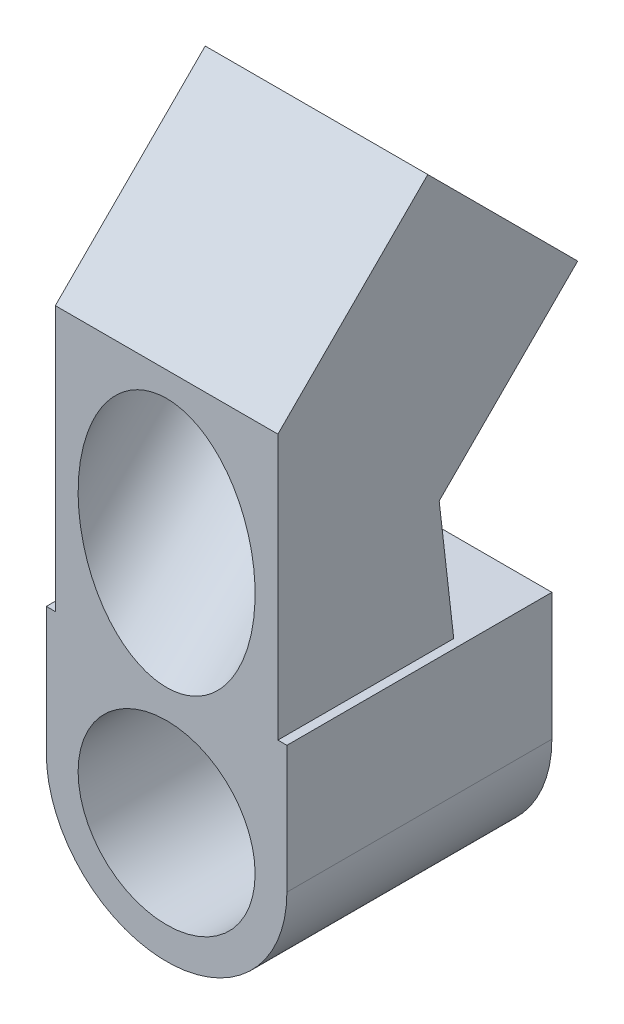
ISO-10303-21;
HEADER;
FILE_DESCRIPTION(('STEP AP214'),'2;1');
FILE_NAME('part.step','',(''),(''),'','','');
FILE_SCHEMA(('AUTOMOTIVE_DESIGN { 1 0 10303 214 1 1 1 1 }'));
ENDSEC;
DATA;
#1=APPLICATION_CONTEXT('core data for automotive mechanical design processes');
#2=APPLICATION_PROTOCOL_DEFINITION('international standard','automotive_design',2000,#1);
#3=PRODUCT_CONTEXT('',#1,'mechanical');
#4=PRODUCT('Part','Part','',(#3));
#5=PRODUCT_RELATED_PRODUCT_CATEGORY('part','',(#4));
#6=PRODUCT_DEFINITION_FORMATION('','',#4);
#7=PRODUCT_DEFINITION_CONTEXT('part definition',#1,'design');
#8=PRODUCT_DEFINITION('design','',#6,#7);
#9=PRODUCT_DEFINITION_SHAPE('','',#8);
#10=(LENGTH_UNIT() NAMED_UNIT(*) SI_UNIT(.MILLI.,.METRE.));
#11=(NAMED_UNIT(*) PLANE_ANGLE_UNIT() SI_UNIT($,.RADIAN.));
#12=(NAMED_UNIT(*) SI_UNIT($,.STERADIAN.) SOLID_ANGLE_UNIT());
#13=UNCERTAINTY_MEASURE_WITH_UNIT(LENGTH_MEASURE(1.E-05),#10,'distance_accuracy_value','');
#14=(GEOMETRIC_REPRESENTATION_CONTEXT(3) GLOBAL_UNCERTAINTY_ASSIGNED_CONTEXT((#13)) GLOBAL_UNIT_ASSIGNED_CONTEXT((#10,
#11,#12)) REPRESENTATION_CONTEXT('',''));
#15=CARTESIAN_POINT('',(0.,0.,0.));
#16=DIRECTION('',(0.,0.,1.));
#17=DIRECTION('',(1.,0.,0.));
#18=AXIS2_PLACEMENT_3D('',#15,#16,#17);
#19=CARTESIAN_POINT('',(-11.35,12.,-12.5));
#20=DIRECTION('',(0.,1.,0.));
#21=DIRECTION('',(-1.,0.,0.));
#22=AXIS2_PLACEMENT_3D('',#19,#20,#21);
#23=PLANE('',#22);
#24=DIRECTION('',(-1.,0.,0.));
#25=VECTOR('',#24,1.);
#26=CARTESIAN_POINT('',(-11.35,12.,12.5));
#27=LINE('',#26,#25);
#28=CARTESIAN_POINT('',(-10.5,12.,12.5));
#29=VERTEX_POINT('',#28);
#30=CARTESIAN_POINT('',(-11.35,12.,12.5));
#31=VERTEX_POINT('',#30);
#32=EDGE_CURVE('E62',#29,#31,#27,.T.);
#33=ORIENTED_EDGE('',*,*,#32,.F.);
#34=DIRECTION('',(0.,0.,-1.));
#35=VECTOR('',#34,1.);
#36=CARTESIAN_POINT('',(-10.5,12.,12.5));
#37=LINE('',#36,#35);
#38=CARTESIAN_POINT('',(-10.5,12.,-4.09010033326542));
#39=VERTEX_POINT('',#38);
#40=EDGE_CURVE('E57',#29,#39,#37,.T.);
#41=ORIENTED_EDGE('',*,*,#40,.T.);
#42=DIRECTION('',(-1.,0.,0.));
#43=VECTOR('',#42,1.);
#44=CARTESIAN_POINT('',(10.5,12.,-4.09010033326542));
#45=LINE('',#44,#43);
#46=CARTESIAN_POINT('',(10.5,12.,-4.09010033326542));
#47=VERTEX_POINT('',#46);
#48=EDGE_CURVE('E115',#47,#39,#45,.T.);
#49=ORIENTED_EDGE('',*,*,#48,.F.);
#50=DIRECTION('',(0.,0.,-1.));
#51=VECTOR('',#50,1.);
#52=CARTESIAN_POINT('',(10.5,12.,12.5));
#53=LINE('',#52,#51);
#54=CARTESIAN_POINT('',(10.5,12.,12.5));
#55=VERTEX_POINT('',#54);
#56=EDGE_CURVE('E119',#55,#47,#53,.T.);
#57=ORIENTED_EDGE('',*,*,#56,.F.);
#58=CARTESIAN_POINT('',(11.35,12.,12.5));
#59=VERTEX_POINT('',#58);
#60=EDGE_CURVE('E214',#59,#55,#27,.T.);
#61=ORIENTED_EDGE('',*,*,#60,.F.);
#62=DIRECTION('',(0.,0.,1.));
#63=VECTOR('',#62,1.);
#64=CARTESIAN_POINT('',(11.35,12.,-12.5));
#65=LINE('',#64,#63);
#66=CARTESIAN_POINT('',(11.35,12.,-12.5));
#67=VERTEX_POINT('',#66);
#68=EDGE_CURVE('E43',#67,#59,#65,.T.);
#69=ORIENTED_EDGE('',*,*,#68,.F.);
#70=DIRECTION('',(-1.,0.,0.));
#71=VECTOR('',#70,1.);
#72=CARTESIAN_POINT('',(-11.35,12.,-12.5));
#73=LINE('',#72,#71);
#74=CARTESIAN_POINT('',(-11.35,12.,-12.5));
#75=VERTEX_POINT('',#74);
#76=EDGE_CURVE('E198',#67,#75,#73,.T.);
#77=ORIENTED_EDGE('',*,*,#76,.T.);
#78=DIRECTION('',(0.,0.,1.));
#79=VECTOR('',#78,1.);
#80=CARTESIAN_POINT('',(-11.35,12.,-12.5));
#81=LINE('',#80,#79);
#82=EDGE_CURVE('E225',#75,#31,#81,.T.);
#83=ORIENTED_EDGE('',*,*,#82,.T.);
#84=EDGE_LOOP('',(#33,#41,#49,#57,#61,#69,#77,#83));
#85=FACE_BOUND('',#84,.T.);
#86=ADVANCED_FACE('F39',(#85),#23,.T.);
#87=CARTESIAN_POINT('',(11.35,12.,-12.5));
#88=DIRECTION('',(1.,0.,0.));
#89=DIRECTION('',(0.,1.,0.));
#90=AXIS2_PLACEMENT_3D('',#87,#88,#89);
#91=PLANE('',#90);
#92=DIRECTION('',(0.,1.,0.));
#93=VECTOR('',#92,1.);
#94=CARTESIAN_POINT('',(11.35,12.,12.5));
#95=LINE('',#94,#93);
#96=CARTESIAN_POINT('',(11.35,0.,12.5));
#97=VERTEX_POINT('',#96);
#98=EDGE_CURVE('E190',#97,#59,#95,.T.);
#99=ORIENTED_EDGE('',*,*,#98,.F.);
#100=DIRECTION('',(0.,0.,1.));
#101=VECTOR('',#100,1.);
#102=CARTESIAN_POINT('',(11.35,0.,-12.5));
#103=LINE('',#102,#101);
#104=CARTESIAN_POINT('',(11.35,0.,-12.5));
#105=VERTEX_POINT('',#104);
#106=EDGE_CURVE('E11',#105,#97,#103,.T.);
#107=ORIENTED_EDGE('',*,*,#106,.F.);
#108=DIRECTION('',(0.,1.,0.));
#109=VECTOR('',#108,1.);
#110=CARTESIAN_POINT('',(11.35,12.,-12.5));
#111=LINE('',#110,#109);
#112=EDGE_CURVE('E194',#105,#67,#111,.T.);
#113=ORIENTED_EDGE('',*,*,#112,.T.);
#114=ORIENTED_EDGE('',*,*,#68,.T.);
#115=EDGE_LOOP('',(#99,#107,#113,#114));
#116=FACE_BOUND('',#115,.T.);
#117=ADVANCED_FACE('F41',(#116),#91,.T.);
#118=CARTESIAN_POINT('',(0.,0.,-12.5));
#119=DIRECTION('',(0.,0.,1.));
#120=DIRECTION('',(1.,0.,0.));
#121=AXIS2_PLACEMENT_3D('',#118,#119,#120);
#122=CYLINDRICAL_SURFACE('',#121,11.35);
#123=CARTESIAN_POINT('',(0.,0.,12.5));
#124=DIRECTION('',(0.,0.,1.));
#125=DIRECTION('',(1.,0.,0.));
#126=AXIS2_PLACEMENT_3D('',#123,#124,#125);
#127=CIRCLE('',#126,11.35);
#128=CARTESIAN_POINT('',(-11.35,0.,12.5));
#129=VERTEX_POINT('',#128);
#130=EDGE_CURVE('E199',#129,#97,#127,.T.);
#131=ORIENTED_EDGE('',*,*,#130,.F.);
#132=DIRECTION('',(0.,0.,1.));
#133=VECTOR('',#132,1.);
#134=CARTESIAN_POINT('',(-11.35,0.,-12.5));
#135=LINE('',#134,#133);
#136=CARTESIAN_POINT('',(-11.35,0.,-12.5));
#137=VERTEX_POINT('',#136);
#138=EDGE_CURVE('E49',#137,#129,#135,.T.);
#139=ORIENTED_EDGE('',*,*,#138,.F.);
#140=CARTESIAN_POINT('',(0.,0.,-12.5));
#141=DIRECTION('',(0.,0.,1.));
#142=DIRECTION('',(1.,0.,0.));
#143=AXIS2_PLACEMENT_3D('',#140,#141,#142);
#144=CIRCLE('',#143,11.35);
#145=EDGE_CURVE('E207',#137,#105,#144,.T.);
#146=ORIENTED_EDGE('',*,*,#145,.T.);
#147=ORIENTED_EDGE('',*,*,#106,.T.);
#148=EDGE_LOOP('',(#131,#139,#146,#147));
#149=FACE_BOUND('',#148,.T.);
#150=ADVANCED_FACE('F237',(#149),#122,.T.);
#151=CARTESIAN_POINT('',(-11.35,12.,-12.5));
#152=DIRECTION('',(-1.,0.,0.));
#153=DIRECTION('',(0.,-1.,0.));
#154=AXIS2_PLACEMENT_3D('',#151,#152,#153);
#155=PLANE('',#154);
#156=DIRECTION('',(0.,-1.,0.));
#157=VECTOR('',#156,1.);
#158=CARTESIAN_POINT('',(-11.35,12.,12.5));
#159=LINE('',#158,#157);
#160=EDGE_CURVE('E217',#31,#129,#159,.T.);
#161=ORIENTED_EDGE('',*,*,#160,.F.);
#162=ORIENTED_EDGE('',*,*,#82,.F.);
#163=DIRECTION('',(0.,-1.,0.));
#164=VECTOR('',#163,1.);
#165=CARTESIAN_POINT('',(-11.35,12.,-12.5));
#166=LINE('',#165,#164);
#167=EDGE_CURVE('E203',#75,#137,#166,.T.);
#168=ORIENTED_EDGE('',*,*,#167,.T.);
#169=ORIENTED_EDGE('',*,*,#138,.T.);
#170=EDGE_LOOP('',(#161,#162,#168,#169));
#171=FACE_BOUND('',#170,.T.);
#172=ADVANCED_FACE('F243',(#171),#155,.T.);
#173=CARTESIAN_POINT('',(0.,0.,-12.5));
#174=DIRECTION('',(0.,0.,1.));
#175=DIRECTION('',(1.,0.,0.));
#176=AXIS2_PLACEMENT_3D('',#173,#174,#175);
#177=PLANE('',#176);
#178=CARTESIAN_POINT('',(0.,0.,-12.5));
#179=DIRECTION('',(0.,0.,1.));
#180=DIRECTION('',(1.,0.,0.));
#181=AXIS2_PLACEMENT_3D('',#178,#179,#180);
#182=CIRCLE('',#181,8.35);
#183=CARTESIAN_POINT('',(8.35,0.,-12.5));
#184=VERTEX_POINT('',#183);
#185=EDGE_CURVE('E186',#184,#184,#182,.T.);
#186=ORIENTED_EDGE('',*,*,#185,.T.);
#187=EDGE_LOOP('',(#186));
#188=FACE_BOUND('',#187,.T.);
#189=ORIENTED_EDGE('',*,*,#112,.F.);
#190=ORIENTED_EDGE('',*,*,#145,.F.);
#191=ORIENTED_EDGE('',*,*,#167,.F.);
#192=ORIENTED_EDGE('',*,*,#76,.F.);
#193=EDGE_LOOP('',(#189,#190,#191,#192));
#194=FACE_BOUND('',#193,.T.);
#195=ADVANCED_FACE('F240',(#188,#194),#177,.F.);
#196=CARTESIAN_POINT('',(0.,0.,12.5));
#197=DIRECTION('',(0.,0.,1.));
#198=DIRECTION('',(1.,0.,0.));
#199=AXIS2_PLACEMENT_3D('',#196,#197,#198);
#200=PLANE('',#199);
#201=CARTESIAN_POINT('',(0.,22.8578643762691,12.5));
#202=DIRECTION('',(0.,0.,1.));
#203=DIRECTION('',(0.,1.,0.));
#204=AXIS2_PLACEMENT_3D('',#201,#202,#203);
#205=ELLIPSE('',#204,11.8086832458153,8.35);
#206=CARTESIAN_POINT('',(0.,34.6665476220844,12.5));
#207=VERTEX_POINT('',#206);
#208=EDGE_CURVE('E146',#207,#207,#205,.T.);
#209=ORIENTED_EDGE('',*,*,#208,.F.);
#210=EDGE_LOOP('',(#209));
#211=FACE_BOUND('',#210,.T.);
#212=CARTESIAN_POINT('',(0.,0.,12.5));
#213=DIRECTION('',(0.,0.,1.));
#214=DIRECTION('',(1.,0.,0.));
#215=AXIS2_PLACEMENT_3D('',#212,#213,#214);
#216=CIRCLE('',#215,8.35);
#217=CARTESIAN_POINT('',(8.35,0.,12.5));
#218=VERTEX_POINT('',#217);
#219=EDGE_CURVE('E123',#218,#218,#216,.T.);
#220=ORIENTED_EDGE('',*,*,#219,.F.);
#221=EDGE_LOOP('',(#220));
#222=FACE_BOUND('',#221,.T.);
#223=ORIENTED_EDGE('',*,*,#98,.T.);
#224=ORIENTED_EDGE('',*,*,#60,.T.);
#225=DIRECTION('',(0.,-1.,0.));
#226=VECTOR('',#225,1.);
#227=CARTESIAN_POINT('',(10.5,12.,12.5));
#228=LINE('',#227,#226);
#229=CARTESIAN_POINT('',(10.5,37.,12.5));
#230=VERTEX_POINT('',#229);
#231=EDGE_CURVE('E138',#230,#55,#228,.T.);
#232=ORIENTED_EDGE('',*,*,#231,.F.);
#233=DIRECTION('',(-1.,0.,0.));
#234=VECTOR('',#233,1.);
#235=CARTESIAN_POINT('',(10.5,37.,12.5));
#236=LINE('',#235,#234);
#237=CARTESIAN_POINT('',(-10.5,37.,12.5));
#238=VERTEX_POINT('',#237);
#239=EDGE_CURVE('E159',#230,#238,#236,.T.);
#240=ORIENTED_EDGE('',*,*,#239,.T.);
#241=DIRECTION('',(0.,-1.,0.));
#242=VECTOR('',#241,1.);
#243=CARTESIAN_POINT('',(-10.5,12.,12.5));
#244=LINE('',#243,#242);
#245=EDGE_CURVE('E140',#238,#29,#244,.T.);
#246=ORIENTED_EDGE('',*,*,#245,.T.);
#247=ORIENTED_EDGE('',*,*,#32,.T.);
#248=ORIENTED_EDGE('',*,*,#160,.T.);
#249=ORIENTED_EDGE('',*,*,#130,.T.);
#250=EDGE_LOOP('',(#223,#224,#232,#240,#246,#247,#248,#249));
#251=FACE_BOUND('',#250,.T.);
#252=ADVANCED_FACE('F234',(#211,#222,#251),#200,.T.);
#253=CARTESIAN_POINT('',(0.,0.,-12.5));
#254=DIRECTION('',(0.,0.,1.));
#255=DIRECTION('',(1.,0.,0.));
#256=AXIS2_PLACEMENT_3D('',#253,#254,#255);
#257=CYLINDRICAL_SURFACE('',#256,8.35);
#258=ORIENTED_EDGE('',*,*,#185,.F.);
#259=EDGE_LOOP('',(#258));
#260=FACE_BOUND('',#259,.T.);
#261=ORIENTED_EDGE('',*,*,#219,.T.);
#262=EDGE_LOOP('',(#261));
#263=FACE_BOUND('',#262,.T.);
#264=ADVANCED_FACE('F280',(#260,#263),#257,.F.);
#265=CARTESIAN_POINT('',(10.5,23.9324106299594,-2.7166818774213));
#266=DIRECTION('',(0.,-0.114344904826,0.993441111863372));
#267=DIRECTION('',(0.,-0.993441111863372,-0.114344904826));
#268=AXIS2_PLACEMENT_3D('',#265,#266,#267);
#269=PLANE('',#268);
#270=DIRECTION('',(0.,0.993441111863372,0.114344904826));
#271=VECTOR('',#270,1.);
#272=CARTESIAN_POINT('',(-10.5,23.9324106299594,-2.7166818774213));
#273=LINE('',#272,#271);
#274=CARTESIAN_POINT('',(-10.5,23.9324106299594,-2.7166818774213));
#275=VERTEX_POINT('',#274);
#276=EDGE_CURVE('E162',#39,#275,#273,.T.);
#277=ORIENTED_EDGE('',*,*,#276,.T.);
#278=DIRECTION('',(-1.,0.,0.));
#279=VECTOR('',#278,1.);
#280=CARTESIAN_POINT('',(10.5,23.9324106299594,-2.7166818774213));
#281=LINE('',#280,#279);
#282=CARTESIAN_POINT('',(10.5,23.9324106299594,-2.7166818774213));
#283=VERTEX_POINT('',#282);
#284=EDGE_CURVE('E124',#283,#275,#281,.T.);
#285=ORIENTED_EDGE('',*,*,#284,.F.);
#286=DIRECTION('',(0.,0.993441111863372,0.114344904826));
#287=VECTOR('',#286,1.);
#288=CARTESIAN_POINT('',(10.5,23.9324106299594,-2.7166818774213));
#289=LINE('',#288,#287);
#290=EDGE_CURVE('E127',#47,#283,#289,.T.);
#291=ORIENTED_EDGE('',*,*,#290,.F.);
#292=ORIENTED_EDGE('',*,*,#48,.T.);
#293=EDGE_LOOP('',(#277,#285,#291,#292));
#294=FACE_BOUND('',#293,.T.);
#295=ADVANCED_FACE('F128',(#294),#269,.F.);
#296=CARTESIAN_POINT('',(10.5,37.,-15.7842712474619));
#297=DIRECTION('',(0.,0.707106781186549,0.707106781186546));
#298=DIRECTION('',(0.,-0.707106781186546,0.707106781186549));
#299=AXIS2_PLACEMENT_3D('',#296,#297,#298);
#300=PLANE('',#299);
#301=DIRECTION('',(0.,0.707106781186546,-0.707106781186549));
#302=VECTOR('',#301,1.);
#303=CARTESIAN_POINT('',(-10.5,37.,-15.7842712474619));
#304=LINE('',#303,#302);
#305=CARTESIAN_POINT('',(-10.5,37.,-15.7842712474619));
#306=VERTEX_POINT('',#305);
#307=EDGE_CURVE('E165',#275,#306,#304,.T.);
#308=ORIENTED_EDGE('',*,*,#307,.T.);
#309=DIRECTION('',(-1.,0.,0.));
#310=VECTOR('',#309,1.);
#311=CARTESIAN_POINT('',(10.5,37.,-15.7842712474619));
#312=LINE('',#311,#310);
#313=CARTESIAN_POINT('',(10.5,37.,-15.7842712474619));
#314=VERTEX_POINT('',#313);
#315=EDGE_CURVE('E180',#314,#306,#312,.T.);
#316=ORIENTED_EDGE('',*,*,#315,.F.);
#317=DIRECTION('',(0.,0.707106781186546,-0.707106781186549));
#318=VECTOR('',#317,1.);
#319=CARTESIAN_POINT('',(10.5,37.,-15.7842712474619));
#320=LINE('',#319,#318);
#321=EDGE_CURVE('E133',#283,#314,#320,.T.);
#322=ORIENTED_EDGE('',*,*,#321,.F.);
#323=ORIENTED_EDGE('',*,*,#284,.T.);
#324=EDGE_LOOP('',(#308,#316,#322,#323));
#325=FACE_BOUND('',#324,.T.);
#326=ADVANCED_FACE('F299',(#325),#300,.F.);
#327=CARTESIAN_POINT('',(10.5,51.1421356237309,-1.64213562373097));
#328=DIRECTION('',(0.,-0.707106781186546,0.707106781186549));
#329=DIRECTION('',(0.,-0.707106781186549,-0.707106781186546));
#330=AXIS2_PLACEMENT_3D('',#327,#328,#329);
#331=PLANE('',#330);
#332=CARTESIAN_POINT('',(0.,44.0710678118655,-8.71320343559644));
#333=DIRECTION('',(0.,0.707106781186546,-0.707106781186549));
#334=DIRECTION('',(0.,0.707106781186549,0.707106781186546));
#335=AXIS2_PLACEMENT_3D('',#332,#333,#334);
#336=CIRCLE('',#335,8.35);
#337=CARTESIAN_POINT('',(0.,49.9754094347731,-2.80886181268878));
#338=VERTEX_POINT('',#337);
#339=EDGE_CURVE('E372',#338,#338,#336,.T.);
#340=ORIENTED_EDGE('',*,*,#339,.F.);
#341=EDGE_LOOP('',(#340));
#342=FACE_BOUND('',#341,.T.);
#343=DIRECTION('',(0.,0.707106781186549,0.707106781186546));
#344=VECTOR('',#343,1.);
#345=CARTESIAN_POINT('',(-10.5,51.1421356237309,-1.64213562373097));
#346=LINE('',#345,#344);
#347=CARTESIAN_POINT('',(-10.5,51.1421356237309,-1.64213562373097));
#348=VERTEX_POINT('',#347);
#349=EDGE_CURVE('E168',#306,#348,#346,.T.);
#350=ORIENTED_EDGE('',*,*,#349,.T.);
#351=DIRECTION('',(-1.,0.,0.));
#352=VECTOR('',#351,1.);
#353=CARTESIAN_POINT('',(10.5,51.1421356237309,-1.64213562373097));
#354=LINE('',#353,#352);
#355=CARTESIAN_POINT('',(10.5,51.1421356237309,-1.64213562373097));
#356=VERTEX_POINT('',#355);
#357=EDGE_CURVE('E176',#356,#348,#354,.T.);
#358=ORIENTED_EDGE('',*,*,#357,.F.);
#359=DIRECTION('',(0.,0.707106781186549,0.707106781186546));
#360=VECTOR('',#359,1.);
#361=CARTESIAN_POINT('',(10.5,51.1421356237309,-1.64213562373097));
#362=LINE('',#361,#360);
#363=EDGE_CURVE('E151',#314,#356,#362,.T.);
#364=ORIENTED_EDGE('',*,*,#363,.F.);
#365=ORIENTED_EDGE('',*,*,#315,.T.);
#366=EDGE_LOOP('',(#350,#358,#364,#365));
#367=FACE_BOUND('',#366,.T.);
#368=ADVANCED_FACE('F308',(#342,#367),#331,.F.);
#369=CARTESIAN_POINT('',(10.5,37.,12.5));
#370=DIRECTION('',(0.,-0.707106781186549,-0.707106781186546));
#371=DIRECTION('',(0.,0.707106781186546,-0.707106781186549));
#372=AXIS2_PLACEMENT_3D('',#369,#370,#371);
#373=PLANE('',#372);
#374=DIRECTION('',(0.,-0.707106781186546,0.707106781186549));
#375=VECTOR('',#374,1.);
#376=CARTESIAN_POINT('',(-10.5,37.,12.5));
#377=LINE('',#376,#375);
#378=EDGE_CURVE('E143',#348,#238,#377,.T.);
#379=ORIENTED_EDGE('',*,*,#378,.T.);
#380=ORIENTED_EDGE('',*,*,#239,.F.);
#381=DIRECTION('',(0.,-0.707106781186546,0.707106781186549));
#382=VECTOR('',#381,1.);
#383=CARTESIAN_POINT('',(10.5,37.,12.5));
#384=LINE('',#383,#382);
#385=EDGE_CURVE('E154',#356,#230,#384,.T.);
#386=ORIENTED_EDGE('',*,*,#385,.F.);
#387=ORIENTED_EDGE('',*,*,#357,.T.);
#388=EDGE_LOOP('',(#379,#380,#386,#387));
#389=FACE_BOUND('',#388,.T.);
#390=ADVANCED_FACE('F316',(#389),#373,.F.);
#391=CARTESIAN_POINT('',(10.5,0.,0.));
#392=DIRECTION('',(1.,0.,0.));
#393=DIRECTION('',(0.,0.,-1.));
#394=AXIS2_PLACEMENT_3D('',#391,#392,#393);
#395=PLANE('',#394);
#396=ORIENTED_EDGE('',*,*,#56,.T.);
#397=ORIENTED_EDGE('',*,*,#290,.T.);
#398=ORIENTED_EDGE('',*,*,#321,.T.);
#399=ORIENTED_EDGE('',*,*,#363,.T.);
#400=ORIENTED_EDGE('',*,*,#385,.T.);
#401=ORIENTED_EDGE('',*,*,#231,.T.);
#402=EDGE_LOOP('',(#396,#397,#398,#399,#400,#401));
#403=FACE_BOUND('',#402,.T.);
#404=ADVANCED_FACE('F136',(#403),#395,.T.);
#405=CARTESIAN_POINT('',(-10.5,0.,0.));
#406=DIRECTION('',(1.,0.,0.));
#407=DIRECTION('',(0.,0.,-1.));
#408=AXIS2_PLACEMENT_3D('',#405,#406,#407);
#409=PLANE('',#408);
#410=ORIENTED_EDGE('',*,*,#40,.F.);
#411=ORIENTED_EDGE('',*,*,#245,.F.);
#412=ORIENTED_EDGE('',*,*,#378,.F.);
#413=ORIENTED_EDGE('',*,*,#349,.F.);
#414=ORIENTED_EDGE('',*,*,#307,.F.);
#415=ORIENTED_EDGE('',*,*,#276,.F.);
#416=EDGE_LOOP('',(#410,#411,#412,#413,#414,#415));
#417=FACE_BOUND('',#416,.T.);
#418=ADVANCED_FACE('F330',(#417),#409,.F.);
#419=CARTESIAN_POINT('',(0.,10.8370490960978,24.5208152801713));
#420=DIRECTION('',(0.,0.707106781186546,-0.707106781186549));
#421=DIRECTION('',(0.,0.707106781186549,0.707106781186546));
#422=AXIS2_PLACEMENT_3D('',#419,#420,#421);
#423=CYLINDRICAL_SURFACE('',#422,8.35);
#424=ORIENTED_EDGE('',*,*,#208,.T.);
#425=EDGE_LOOP('',(#424));
#426=FACE_BOUND('',#425,.T.);
#427=ORIENTED_EDGE('',*,*,#339,.T.);
#428=EDGE_LOOP('',(#427));
#429=FACE_BOUND('',#428,.T.);
#430=ADVANCED_FACE('F339',(#426,#429),#423,.F.);
#431=CLOSED_SHELL('',(#86,#117,#150,#172,#195,#252,#264,#295,#326,#368,#390,#404,#418,#430));
#432=MANIFOLD_SOLID_BREP('B2',#431);
#433=ADVANCED_BREP_SHAPE_REPRESENTATION('',(#18,#432),#14);
#434=SHAPE_DEFINITION_REPRESENTATION(#9,#433);
ENDSEC;
END-ISO-10303-21;
